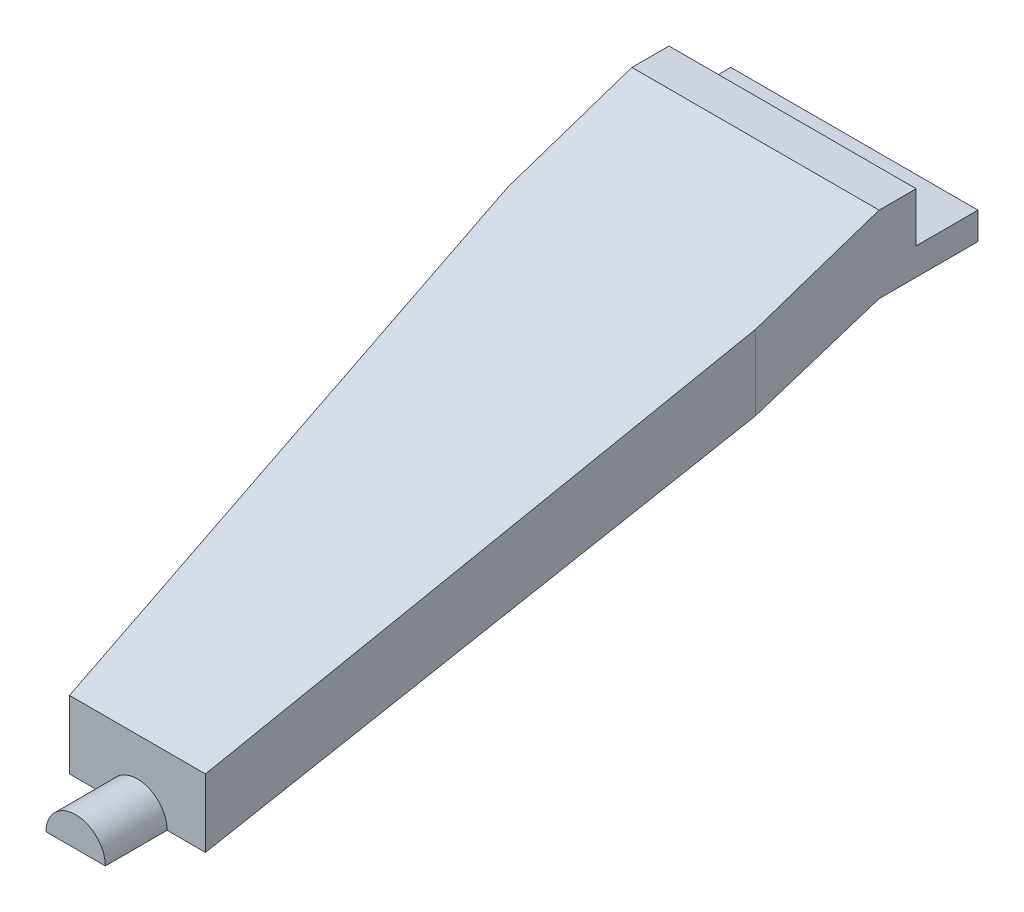
ISO-10303-21;
HEADER;
FILE_DESCRIPTION(('STEP AP214'),'2;1');
FILE_NAME('part.step','',(''),(''),'','','');
FILE_SCHEMA(('AUTOMOTIVE_DESIGN { 1 0 10303 214 1 1 1 1 }'));
ENDSEC;
DATA;
#1=APPLICATION_CONTEXT('core data for automotive mechanical design processes');
#2=APPLICATION_PROTOCOL_DEFINITION('international standard','automotive_design',2000,#1);
#3=PRODUCT_CONTEXT('',#1,'mechanical');
#4=PRODUCT('Part','Part','',(#3));
#5=PRODUCT_RELATED_PRODUCT_CATEGORY('part','',(#4));
#6=PRODUCT_DEFINITION_FORMATION('','',#4);
#7=PRODUCT_DEFINITION_CONTEXT('part definition',#1,'design');
#8=PRODUCT_DEFINITION('design','',#6,#7);
#9=PRODUCT_DEFINITION_SHAPE('','',#8);
#10=(LENGTH_UNIT() NAMED_UNIT(*) SI_UNIT(.MILLI.,.METRE.));
#11=(NAMED_UNIT(*) PLANE_ANGLE_UNIT() SI_UNIT($,.RADIAN.));
#12=(NAMED_UNIT(*) SI_UNIT($,.STERADIAN.) SOLID_ANGLE_UNIT());
#13=UNCERTAINTY_MEASURE_WITH_UNIT(LENGTH_MEASURE(1.E-05),#10,'distance_accuracy_value','');
#14=(GEOMETRIC_REPRESENTATION_CONTEXT(3) GLOBAL_UNCERTAINTY_ASSIGNED_CONTEXT((#13)) GLOBAL_UNIT_ASSIGNED_CONTEXT((#10,
#11,#12)) REPRESENTATION_CONTEXT('',''));
#15=CARTESIAN_POINT('',(0.,0.,0.));
#16=DIRECTION('',(0.,0.,1.));
#17=DIRECTION('',(1.,0.,0.));
#18=AXIS2_PLACEMENT_3D('',#15,#16,#17);
#19=CARTESIAN_POINT('',(0.,-16.0499999999997,0.));
#20=DIRECTION('',(0.,1.,0.));
#21=DIRECTION('',(0.,0.,1.));
#22=AXIS2_PLACEMENT_3D('',#19,#20,#21);
#23=PLANE('',#22);
#24=DIRECTION('',(0.,0.,1.));
#25=VECTOR('',#24,1.);
#26=CARTESIAN_POINT('',(7.59999999999997,-16.0499999999996,57.9999999999995));
#27=LINE('',#26,#25);
#28=CARTESIAN_POINT('',(7.59999999999997,-16.0499999999996,57.9999999999995));
#29=VERTEX_POINT('',#28);
#30=CARTESIAN_POINT('',(7.59999999999997,-16.0499999999996,62.9999999999995));
#31=VERTEX_POINT('',#30);
#32=EDGE_CURVE('E289',#29,#31,#27,.T.);
#33=ORIENTED_EDGE('',*,*,#32,.F.);
#34=DIRECTION('',(1.,0.,0.));
#35=VECTOR('',#34,1.);
#36=CARTESIAN_POINT('',(1.28369537222284E-13,-16.0499999999997,57.9999999999993));
#37=LINE('',#36,#35);
#38=CARTESIAN_POINT('',(12.4,-16.0499999999996,57.9999999999995));
#39=VERTEX_POINT('',#38);
#40=EDGE_CURVE('E169',#29,#39,#37,.T.);
#41=ORIENTED_EDGE('',*,*,#40,.T.);
#42=DIRECTION('',(0.,0.,1.));
#43=VECTOR('',#42,1.);
#44=CARTESIAN_POINT('',(12.4,-16.0499999999996,57.9999999999995));
#45=LINE('',#44,#43);
#46=CARTESIAN_POINT('',(12.4,-16.0499999999996,62.9999999999995));
#47=VERTEX_POINT('',#46);
#48=EDGE_CURVE('E293',#39,#47,#45,.T.);
#49=ORIENTED_EDGE('',*,*,#48,.T.);
#50=DIRECTION('',(1.,0.,0.));
#51=VECTOR('',#50,1.);
#52=CARTESIAN_POINT('',(0.,-16.0499999999996,62.9999999999993));
#53=LINE('',#52,#51);
#54=EDGE_CURVE('E177',#31,#47,#53,.T.);
#55=ORIENTED_EDGE('',*,*,#54,.F.);
#56=EDGE_LOOP('',(#33,#41,#49,#55));
#57=FACE_BOUND('',#56,.T.);
#58=ADVANCED_FACE('F65',(#57),#23,.F.);
#59=CARTESIAN_POINT('',(1.28369537222284E-13,0.,62.9999999999995));
#60=DIRECTION('',(0.,0.,1.));
#61=DIRECTION('',(0.,-1.,0.));
#62=AXIS2_PLACEMENT_3D('',#59,#60,#61);
#63=PLANE('',#62);
#64=ORIENTED_EDGE('',*,*,#54,.T.);
#65=CARTESIAN_POINT('',(9.99999999999998,-16.0499999999998,62.9999999999995));
#66=DIRECTION('',(0.,0.,1.));
#67=DIRECTION('',(1.,0.,0.));
#68=AXIS2_PLACEMENT_3D('',#65,#66,#67);
#69=CIRCLE('',#68,2.4);
#70=EDGE_CURVE('E299',#47,#31,#69,.T.);
#71=ORIENTED_EDGE('',*,*,#70,.T.);
#72=EDGE_LOOP('',(#64,#71));
#73=FACE_BOUND('',#72,.T.);
#74=ADVANCED_FACE('F235',(#73),#63,.T.);
#75=CARTESIAN_POINT('',(20.,2.2,0.));
#76=DIRECTION('',(1.,0.,0.));
#77=DIRECTION('',(0.,0.,-1.));
#78=AXIS2_PLACEMENT_3D('',#75,#76,#77);
#79=PLANE('',#78);
#80=DIRECTION('',(0.,-0.31764972280847,0.948208127786139));
#81=VECTOR('',#80,1.);
#82=CARTESIAN_POINT('',(20.,7.98399604397154,2.67463867473144));
#83=LINE('',#82,#81);
#84=CARTESIAN_POINT('',(19.9999999999973,6.20000000000593,8.));
#85=VERTEX_POINT('',#84);
#86=CARTESIAN_POINT('',(20.,2.85000000000474,18.));
#87=VERTEX_POINT('',#86);
#88=EDGE_CURVE('E267',#85,#87,#83,.T.);
#89=ORIENTED_EDGE('',*,*,#88,.T.);
#90=DIRECTION('',(0.,1.,0.));
#91=VECTOR('',#90,1.);
#92=CARTESIAN_POINT('',(20.,-16.0499999999998,18.));
#93=LINE('',#92,#91);
#94=CARTESIAN_POINT('',(20.,-3.20999999999994,18.));
#95=VERTEX_POINT('',#94);
#96=EDGE_CURVE('E283',#95,#87,#93,.T.);
#97=ORIENTED_EDGE('',*,*,#96,.F.);
#98=DIRECTION('',(0.,0.305639305857185,-0.952147370271603));
#99=VECTOR('',#98,1.);
#100=CARTESIAN_POINT('',(20.,2.32810929058853,0.747323082278942));
#101=LINE('',#100,#99);
#102=CARTESIAN_POINT('',(20.,0.,8.));
#103=VERTEX_POINT('',#102);
#104=EDGE_CURVE('E180',#95,#103,#101,.T.);
#105=ORIENTED_EDGE('',*,*,#104,.T.);
#106=DIRECTION('',(0.,0.,1.));
#107=VECTOR('',#106,1.);
#108=CARTESIAN_POINT('',(20.,0.,0.));
#109=LINE('',#108,#107);
#110=CARTESIAN_POINT('',(20.,0.,0.));
#111=VERTEX_POINT('',#110);
#112=EDGE_CURVE('E116',#111,#103,#109,.T.);
#113=ORIENTED_EDGE('',*,*,#112,.F.);
#114=DIRECTION('',(0.,-1.,0.));
#115=VECTOR('',#114,1.);
#116=CARTESIAN_POINT('',(20.,2.2,0.));
#117=LINE('',#116,#115);
#118=CARTESIAN_POINT('',(20.,2.2,0.));
#119=VERTEX_POINT('',#118);
#120=EDGE_CURVE('E92',#119,#111,#117,.T.);
#121=ORIENTED_EDGE('',*,*,#120,.F.);
#122=DIRECTION('',(0.,0.,1.));
#123=VECTOR('',#122,1.);
#124=CARTESIAN_POINT('',(20.,2.2,0.));
#125=LINE('',#124,#123);
#126=CARTESIAN_POINT('',(20.,2.2,5.));
#127=VERTEX_POINT('',#126);
#128=EDGE_CURVE('E113',#119,#127,#125,.T.);
#129=ORIENTED_EDGE('',*,*,#128,.T.);
#130=DIRECTION('',(0.,1.,0.));
#131=VECTOR('',#130,1.);
#132=CARTESIAN_POINT('',(19.9999999999973,0.,5.));
#133=LINE('',#132,#131);
#134=CARTESIAN_POINT('',(19.9999999999973,6.20000000000593,5.));
#135=VERTEX_POINT('',#134);
#136=EDGE_CURVE('E192',#127,#135,#133,.T.);
#137=ORIENTED_EDGE('',*,*,#136,.T.);
#138=DIRECTION('',(0.,0.,-1.));
#139=VECTOR('',#138,1.);
#140=CARTESIAN_POINT('',(19.9999999999973,6.20000000000593,8.));
#141=LINE('',#140,#139);
#142=EDGE_CURVE('E199',#85,#135,#141,.T.);
#143=ORIENTED_EDGE('',*,*,#142,.F.);
#144=EDGE_LOOP('',(#89,#97,#105,#113,#121,#129,#137,#143));
#145=FACE_BOUND('',#144,.T.);
#146=ADVANCED_FACE('F111',(#145),#79,.T.);
#147=CARTESIAN_POINT('',(0.,7.98399604397154,2.67463867473141));
#148=DIRECTION('',(0.,0.948208127786142,0.317649722808471));
#149=DIRECTION('',(0.,-0.317649722808471,0.948208127786143));
#150=AXIS2_PLACEMENT_3D('',#147,#148,#149);
#151=PLANE('',#150);
#152=DIRECTION('',(1.,0.,0.));
#153=VECTOR('',#152,1.);
#154=CARTESIAN_POINT('',(0.,-10.5499999999999,57.9999999999999));
#155=LINE('',#154,#153);
#156=CARTESIAN_POINT('',(4.49999999999995,-10.549999999999,57.9999999999995));
#157=VERTEX_POINT('',#156);
#158=CARTESIAN_POINT('',(15.5,-10.549999999999,57.9999999999995));
#159=VERTEX_POINT('',#158);
#160=EDGE_CURVE('E184',#157,#159,#155,.T.);
#161=ORIENTED_EDGE('',*,*,#160,.T.);
#162=DIRECTION('',(0.106071615549872,0.315857699637507,-0.942858804887743));
#163=VECTOR('',#162,1.);
#164=CARTESIAN_POINT('',(21.4796811885696,7.2561617615247,4.84727832382572));
#165=LINE('',#164,#163);
#166=EDGE_CURVE('E279',#159,#87,#165,.T.);
#167=ORIENTED_EDGE('',*,*,#166,.T.);
#168=ORIENTED_EDGE('',*,*,#88,.F.);
#169=DIRECTION('',(1.,0.,0.));
#170=VECTOR('',#169,1.);
#171=CARTESIAN_POINT('',(0.,6.20000000000593,8.));
#172=LINE('',#171,#170);
#173=CARTESIAN_POINT('',(0.,6.20000000000605,7.99999999999983));
#174=VERTEX_POINT('',#173);
#175=EDGE_CURVE('E188',#174,#85,#172,.T.);
#176=ORIENTED_EDGE('',*,*,#175,.F.);
#177=DIRECTION('',(0.,-0.31764972280847,0.948208127786139));
#178=VECTOR('',#177,1.);
#179=CARTESIAN_POINT('',(0.,7.98399604397154,2.67463867473141));
#180=LINE('',#179,#178);
#181=CARTESIAN_POINT('',(0.,2.85000000000473,18.));
#182=VERTEX_POINT('',#181);
#183=EDGE_CURVE('E272',#174,#182,#180,.T.);
#184=ORIENTED_EDGE('',*,*,#183,.T.);
#185=DIRECTION('',(-0.10607161554987,0.315857699637506,-0.942858804887743));
#186=VECTOR('',#185,1.);
#187=CARTESIAN_POINT('',(-1.7047049410768,7.92623249121302,2.84706719042844));
#188=LINE('',#187,#186);
#189=EDGE_CURVE('E281',#157,#182,#188,.T.);
#190=ORIENTED_EDGE('',*,*,#189,.F.);
#191=EDGE_LOOP('',(#161,#167,#168,#176,#184,#190));
#192=FACE_BOUND('',#191,.T.);
#193=ADVANCED_FACE('F246',(#192),#151,.T.);
#194=CARTESIAN_POINT('',(0.,2.32810929058853,0.747323082278914));
#195=DIRECTION('',(0.,-0.952147370271607,-0.305639305857187));
#196=DIRECTION('',(0.,0.305639305857187,-0.952147370271607));
#197=AXIS2_PLACEMENT_3D('',#194,#195,#196);
#198=PLANE('',#197);
#199=ORIENTED_EDGE('',*,*,#104,.F.);
#200=DIRECTION('',(-0.106507291622807,-0.303900805430409,0.946731481091615));
#201=VECTOR('',#200,1.);
#202=CARTESIAN_POINT('',(21.6920326056195,1.61793303470101,2.95971017227122));
#203=LINE('',#202,#201);
#204=CARTESIAN_POINT('',(15.4999999999999,-16.0499999999998,57.9999999999999));
#205=VERTEX_POINT('',#204);
#206=EDGE_CURVE('E12',#95,#205,#203,.T.);
#207=ORIENTED_EDGE('',*,*,#206,.T.);
#208=DIRECTION('',(1.,0.,0.));
#209=VECTOR('',#208,1.);
#210=CARTESIAN_POINT('',(0.,-16.0499999999996,57.9999999999995));
#211=LINE('',#210,#209);
#212=EDGE_CURVE('E296',#39,#205,#211,.T.);
#213=ORIENTED_EDGE('',*,*,#212,.F.);
#214=ORIENTED_EDGE('',*,*,#40,.F.);
#215=CARTESIAN_POINT('',(4.49999999999995,-16.0499999999998,57.9999999999995));
#216=VERTEX_POINT('',#215);
#217=EDGE_CURVE('E164',#216,#29,#37,.T.);
#218=ORIENTED_EDGE('',*,*,#217,.F.);
#219=DIRECTION('',(0.106507291622806,-0.303900805430409,0.946731481091615));
#220=VECTOR('',#219,1.);
#221=CARTESIAN_POINT('',(-1.918908668996,2.26528606886865,0.94303405336888));
#222=LINE('',#221,#220);
#223=CARTESIAN_POINT('',(0.,-3.20999999999995,18.));
#224=VERTEX_POINT('',#223);
#225=EDGE_CURVE('E74',#224,#216,#222,.T.);
#226=ORIENTED_EDGE('',*,*,#225,.F.);
#227=DIRECTION('',(0.,0.305639305857185,-0.952147370271603));
#228=VECTOR('',#227,1.);
#229=CARTESIAN_POINT('',(0.,2.32810929058853,0.747323082278914));
#230=LINE('',#229,#228);
#231=CARTESIAN_POINT('',(0.,0.,7.99999999999997));
#232=VERTEX_POINT('',#231);
#233=EDGE_CURVE('E187',#224,#232,#230,.T.);
#234=ORIENTED_EDGE('',*,*,#233,.T.);
#235=DIRECTION('',(1.,0.,0.));
#236=VECTOR('',#235,1.);
#237=CARTESIAN_POINT('',(0.,0.,8.));
#238=LINE('',#237,#236);
#239=EDGE_CURVE('E191',#232,#103,#238,.T.);
#240=ORIENTED_EDGE('',*,*,#239,.T.);
#241=EDGE_LOOP('',(#199,#207,#213,#214,#218,#226,#234,#240));
#242=FACE_BOUND('',#241,.T.);
#243=ADVANCED_FACE('F166',(#242),#198,.T.);
#244=CARTESIAN_POINT('',(0.,2.2,0.));
#245=DIRECTION('',(0.,-1.,0.));
#246=DIRECTION('',(0.,0.,-1.));
#247=AXIS2_PLACEMENT_3D('',#244,#245,#246);
#248=PLANE('',#247);
#249=DIRECTION('',(1.,0.,0.));
#250=VECTOR('',#249,1.);
#251=CARTESIAN_POINT('',(0.,2.2,0.));
#252=LINE('',#251,#250);
#253=CARTESIAN_POINT('',(0.,2.2,0.));
#254=VERTEX_POINT('',#253);
#255=EDGE_CURVE('E125',#254,#119,#252,.T.);
#256=ORIENTED_EDGE('',*,*,#255,.F.);
#257=DIRECTION('',(0.,0.,1.));
#258=VECTOR('',#257,1.);
#259=CARTESIAN_POINT('',(0.,2.2,0.));
#260=LINE('',#259,#258);
#261=CARTESIAN_POINT('',(0.,2.2,5.));
#262=VERTEX_POINT('',#261);
#263=EDGE_CURVE('E118',#254,#262,#260,.T.);
#264=ORIENTED_EDGE('',*,*,#263,.T.);
#265=DIRECTION('',(1.,0.,0.));
#266=VECTOR('',#265,1.);
#267=CARTESIAN_POINT('',(0.,2.2,5.));
#268=LINE('',#267,#266);
#269=EDGE_CURVE('E100',#262,#127,#268,.T.);
#270=ORIENTED_EDGE('',*,*,#269,.T.);
#271=ORIENTED_EDGE('',*,*,#128,.F.);
#272=EDGE_LOOP('',(#256,#264,#270,#271));
#273=FACE_BOUND('',#272,.T.);
#274=CARTESIAN_POINT('',(4.,2.2,2.5));
#275=DIRECTION('',(0.,1.,0.));
#276=DIRECTION('',(0.,0.,1.));
#277=AXIS2_PLACEMENT_3D('',#274,#275,#276);
#278=CIRCLE('',#277,0.800000000000001);
#279=CARTESIAN_POINT('',(4.,2.2,3.3));
#280=VERTEX_POINT('',#279);
#281=EDGE_CURVE('E139',#280,#280,#278,.T.);
#282=ORIENTED_EDGE('',*,*,#281,.F.);
#283=EDGE_LOOP('',(#282));
#284=FACE_BOUND('',#283,.T.);
#285=CARTESIAN_POINT('',(16.,2.2,2.5));
#286=DIRECTION('',(0.,1.,0.));
#287=DIRECTION('',(0.,0.,1.));
#288=AXIS2_PLACEMENT_3D('',#285,#286,#287);
#289=CIRCLE('',#288,0.799999999999999);
#290=CARTESIAN_POINT('',(16.,2.2,3.3));
#291=VERTEX_POINT('',#290);
#292=EDGE_CURVE('E205',#291,#291,#289,.T.);
#293=ORIENTED_EDGE('',*,*,#292,.F.);
#294=EDGE_LOOP('',(#293));
#295=FACE_BOUND('',#294,.T.);
#296=ADVANCED_FACE('F122',(#273,#284,#295),#248,.F.);
#297=CARTESIAN_POINT('',(0.,0.,0.));
#298=DIRECTION('',(0.,-1.,0.));
#299=DIRECTION('',(0.,0.,-1.));
#300=AXIS2_PLACEMENT_3D('',#297,#298,#299);
#301=PLANE('',#300);
#302=CARTESIAN_POINT('',(4.,0.,2.5));
#303=DIRECTION('',(0.,1.,0.));
#304=DIRECTION('',(0.,0.,1.));
#305=AXIS2_PLACEMENT_3D('',#302,#303,#304);
#306=CIRCLE('',#305,0.800000000000001);
#307=CARTESIAN_POINT('',(4.,0.,3.3));
#308=VERTEX_POINT('',#307);
#309=EDGE_CURVE('E132',#308,#308,#306,.T.);
#310=ORIENTED_EDGE('',*,*,#309,.T.);
#311=EDGE_LOOP('',(#310));
#312=FACE_BOUND('',#311,.T.);
#313=DIRECTION('',(1.,0.,0.));
#314=VECTOR('',#313,1.);
#315=CARTESIAN_POINT('',(0.,0.,0.));
#316=LINE('',#315,#314);
#317=CARTESIAN_POINT('',(0.,0.,0.));
#318=VERTEX_POINT('',#317);
#319=EDGE_CURVE('E137',#318,#111,#316,.T.);
#320=ORIENTED_EDGE('',*,*,#319,.T.);
#321=ORIENTED_EDGE('',*,*,#112,.T.);
#322=ORIENTED_EDGE('',*,*,#239,.F.);
#323=DIRECTION('',(0.,0.,1.));
#324=VECTOR('',#323,1.);
#325=CARTESIAN_POINT('',(0.,0.,0.));
#326=LINE('',#325,#324);
#327=EDGE_CURVE('E127',#318,#232,#326,.T.);
#328=ORIENTED_EDGE('',*,*,#327,.F.);
#329=EDGE_LOOP('',(#320,#321,#322,#328));
#330=FACE_BOUND('',#329,.T.);
#331=CARTESIAN_POINT('',(16.,0.,2.5));
#332=DIRECTION('',(0.,1.,0.));
#333=DIRECTION('',(0.,0.,1.));
#334=AXIS2_PLACEMENT_3D('',#331,#332,#333);
#335=CIRCLE('',#334,0.799999999999999);
#336=CARTESIAN_POINT('',(16.,0.,3.3));
#337=VERTEX_POINT('',#336);
#338=EDGE_CURVE('E202',#337,#337,#335,.T.);
#339=ORIENTED_EDGE('',*,*,#338,.T.);
#340=EDGE_LOOP('',(#339));
#341=FACE_BOUND('',#340,.T.);
#342=ADVANCED_FACE('F215',(#312,#330,#341),#301,.T.);
#343=CARTESIAN_POINT('',(0.,2.2,0.));
#344=DIRECTION('',(0.,0.,-1.));
#345=DIRECTION('',(-1.,0.,0.));
#346=AXIS2_PLACEMENT_3D('',#343,#344,#345);
#347=PLANE('',#346);
#348=ORIENTED_EDGE('',*,*,#319,.F.);
#349=DIRECTION('',(0.,-1.,0.));
#350=VECTOR('',#349,1.);
#351=CARTESIAN_POINT('',(0.,2.2,0.));
#352=LINE('',#351,#350);
#353=EDGE_CURVE('E82',#254,#318,#352,.T.);
#354=ORIENTED_EDGE('',*,*,#353,.F.);
#355=ORIENTED_EDGE('',*,*,#255,.T.);
#356=ORIENTED_EDGE('',*,*,#120,.T.);
#357=EDGE_LOOP('',(#348,#354,#355,#356));
#358=FACE_BOUND('',#357,.T.);
#359=ADVANCED_FACE('F67',(#358),#347,.T.);
#360=CARTESIAN_POINT('',(0.,2.2,0.));
#361=DIRECTION('',(1.,0.,0.));
#362=DIRECTION('',(0.,0.,-1.));
#363=AXIS2_PLACEMENT_3D('',#360,#361,#362);
#364=PLANE('',#363);
#365=ORIENTED_EDGE('',*,*,#233,.F.);
#366=DIRECTION('',(0.,1.,0.));
#367=VECTOR('',#366,1.);
#368=CARTESIAN_POINT('',(0.,-16.0499999999998,18.));
#369=LINE('',#368,#367);
#370=EDGE_CURVE('E156',#224,#182,#369,.T.);
#371=ORIENTED_EDGE('',*,*,#370,.T.);
#372=ORIENTED_EDGE('',*,*,#183,.F.);
#373=DIRECTION('',(0.,0.,-1.));
#374=VECTOR('',#373,1.);
#375=CARTESIAN_POINT('',(0.,6.20000000000593,8.));
#376=LINE('',#375,#374);
#377=CARTESIAN_POINT('',(0.,6.20000000000593,5.));
#378=VERTEX_POINT('',#377);
#379=EDGE_CURVE('E194',#174,#378,#376,.T.);
#380=ORIENTED_EDGE('',*,*,#379,.T.);
#381=DIRECTION('',(0.,1.,0.));
#382=VECTOR('',#381,1.);
#383=CARTESIAN_POINT('',(0.,0.,5.));
#384=LINE('',#383,#382);
#385=EDGE_CURVE('E173',#262,#378,#384,.T.);
#386=ORIENTED_EDGE('',*,*,#385,.F.);
#387=ORIENTED_EDGE('',*,*,#263,.F.);
#388=ORIENTED_EDGE('',*,*,#353,.T.);
#389=ORIENTED_EDGE('',*,*,#327,.T.);
#390=EDGE_LOOP('',(#365,#371,#372,#380,#386,#387,#388,#389));
#391=FACE_BOUND('',#390,.T.);
#392=ADVANCED_FACE('F221',(#391),#364,.F.);
#393=CARTESIAN_POINT('',(4.,2.2,2.5));
#394=DIRECTION('',(0.,-1.,0.));
#395=DIRECTION('',(0.,0.,-1.));
#396=AXIS2_PLACEMENT_3D('',#393,#394,#395);
#397=CYLINDRICAL_SURFACE('',#396,0.800000000000001);
#398=ORIENTED_EDGE('',*,*,#281,.T.);
#399=EDGE_LOOP('',(#398));
#400=FACE_BOUND('',#399,.T.);
#401=ORIENTED_EDGE('',*,*,#309,.F.);
#402=EDGE_LOOP('',(#401));
#403=FACE_BOUND('',#402,.T.);
#404=ADVANCED_FACE('F218',(#400,#403),#397,.F.);
#405=CARTESIAN_POINT('',(16.,2.2,2.5));
#406=DIRECTION('',(0.,-1.,0.));
#407=DIRECTION('',(0.,0.,-1.));
#408=AXIS2_PLACEMENT_3D('',#405,#406,#407);
#409=CYLINDRICAL_SURFACE('',#408,0.799999999999999);
#410=ORIENTED_EDGE('',*,*,#292,.T.);
#411=EDGE_LOOP('',(#410));
#412=FACE_BOUND('',#411,.T.);
#413=ORIENTED_EDGE('',*,*,#338,.F.);
#414=EDGE_LOOP('',(#413));
#415=FACE_BOUND('',#414,.T.);
#416=ADVANCED_FACE('F220',(#412,#415),#409,.F.);
#417=CARTESIAN_POINT('',(0.,0.,5.));
#418=DIRECTION('',(0.,0.,-1.));
#419=DIRECTION('',(-1.,0.,0.));
#420=AXIS2_PLACEMENT_3D('',#417,#418,#419);
#421=PLANE('',#420);
#422=ORIENTED_EDGE('',*,*,#269,.F.);
#423=ORIENTED_EDGE('',*,*,#385,.T.);
#424=DIRECTION('',(1.,0.,0.));
#425=VECTOR('',#424,1.);
#426=CARTESIAN_POINT('',(0.,6.20000000000593,5.));
#427=LINE('',#426,#425);
#428=EDGE_CURVE('E175',#378,#135,#427,.T.);
#429=ORIENTED_EDGE('',*,*,#428,.T.);
#430=ORIENTED_EDGE('',*,*,#136,.F.);
#431=EDGE_LOOP('',(#422,#423,#429,#430));
#432=FACE_BOUND('',#431,.T.);
#433=ADVANCED_FACE('F227',(#432),#421,.T.);
#434=CARTESIAN_POINT('',(0.,6.20000000000593,8.));
#435=DIRECTION('',(0.,1.,0.));
#436=DIRECTION('',(0.,0.,1.));
#437=AXIS2_PLACEMENT_3D('',#434,#435,#436);
#438=PLANE('',#437);
#439=ORIENTED_EDGE('',*,*,#428,.F.);
#440=ORIENTED_EDGE('',*,*,#379,.F.);
#441=ORIENTED_EDGE('',*,*,#175,.T.);
#442=ORIENTED_EDGE('',*,*,#142,.T.);
#443=EDGE_LOOP('',(#439,#440,#441,#442));
#444=FACE_BOUND('',#443,.T.);
#445=ADVANCED_FACE('F252',(#444),#438,.T.);
#446=CARTESIAN_POINT('',(-1.99969140564728,-16.0499999999998,0.224965283135317));
#447=DIRECTION('',(0.993731316158802,0.,-0.111794773067865));
#448=DIRECTION('',(-0.111794773067865,0.,-0.993731316158802));
#449=AXIS2_PLACEMENT_3D('',#446,#447,#448);
#450=PLANE('',#449);
#451=ORIENTED_EDGE('',*,*,#189,.T.);
#452=ORIENTED_EDGE('',*,*,#370,.F.);
#453=ORIENTED_EDGE('',*,*,#225,.T.);
#454=DIRECTION('',(0.,1.,0.));
#455=VECTOR('',#454,1.);
#456=CARTESIAN_POINT('',(4.49999999999995,-16.0499999999998,57.9999999999999));
#457=LINE('',#456,#455);
#458=EDGE_CURVE('E152',#216,#157,#457,.T.);
#459=ORIENTED_EDGE('',*,*,#458,.T.);
#460=EDGE_LOOP('',(#451,#452,#453,#459));
#461=FACE_BOUND('',#460,.T.);
#462=ADVANCED_FACE('F149',(#461),#450,.F.);
#463=CARTESIAN_POINT('',(21.7497299799413,-16.0499999999998,2.44684462274341));
#464=DIRECTION('',(0.993731316158802,0.,0.111794773067866));
#465=DIRECTION('',(0.111794773067866,0.,-0.993731316158802));
#466=AXIS2_PLACEMENT_3D('',#463,#464,#465);
#467=PLANE('',#466);
#468=DIRECTION('',(0.,1.,0.));
#469=VECTOR('',#468,1.);
#470=CARTESIAN_POINT('',(15.4999999999999,-16.0499999999998,57.9999999999999));
#471=LINE('',#470,#469);
#472=EDGE_CURVE('E285',#205,#159,#471,.T.);
#473=ORIENTED_EDGE('',*,*,#472,.F.);
#474=ORIENTED_EDGE('',*,*,#206,.F.);
#475=ORIENTED_EDGE('',*,*,#96,.T.);
#476=ORIENTED_EDGE('',*,*,#166,.F.);
#477=EDGE_LOOP('',(#473,#474,#475,#476));
#478=FACE_BOUND('',#477,.T.);
#479=ADVANCED_FACE('F259',(#478),#467,.T.);
#480=CARTESIAN_POINT('',(9.99999999999998,-16.0499999999998,57.9999999999995));
#481=DIRECTION('',(0.,0.,1.));
#482=DIRECTION('',(1.,0.,0.));
#483=AXIS2_PLACEMENT_3D('',#480,#481,#482);
#484=CYLINDRICAL_SURFACE('',#483,2.4);
#485=ORIENTED_EDGE('',*,*,#70,.F.);
#486=ORIENTED_EDGE('',*,*,#48,.F.);
#487=CARTESIAN_POINT('',(9.99999999999998,-16.0499999999998,57.9999999999995));
#488=DIRECTION('',(0.,0.,1.));
#489=DIRECTION('',(1.,0.,0.));
#490=AXIS2_PLACEMENT_3D('',#487,#488,#489);
#491=CIRCLE('',#490,2.4);
#492=EDGE_CURVE('E302',#39,#29,#491,.T.);
#493=ORIENTED_EDGE('',*,*,#492,.T.);
#494=ORIENTED_EDGE('',*,*,#32,.T.);
#495=EDGE_LOOP('',(#485,#486,#493,#494));
#496=FACE_BOUND('',#495,.T.);
#497=ADVANCED_FACE('F309',(#496),#484,.T.);
#498=CARTESIAN_POINT('',(0.,0.,57.9999999999995));
#499=DIRECTION('',(0.,0.,1.));
#500=DIRECTION('',(1.,0.,0.));
#501=AXIS2_PLACEMENT_3D('',#498,#499,#500);
#502=PLANE('',#501);
#503=ORIENTED_EDGE('',*,*,#492,.F.);
#504=ORIENTED_EDGE('',*,*,#212,.T.);
#505=ORIENTED_EDGE('',*,*,#472,.T.);
#506=ORIENTED_EDGE('',*,*,#160,.F.);
#507=ORIENTED_EDGE('',*,*,#458,.F.);
#508=ORIENTED_EDGE('',*,*,#217,.T.);
#509=EDGE_LOOP('',(#503,#504,#505,#506,#507,#508));
#510=FACE_BOUND('',#509,.T.);
#511=ADVANCED_FACE('F314',(#510),#502,.T.);
#512=CLOSED_SHELL('',(#58,#74,#146,#193,#243,#296,#342,#359,#392,#404,#416,#433,#445,#462,#479,
#497,#511));
#513=MANIFOLD_SOLID_BREP('B2',#512);
#514=ADVANCED_BREP_SHAPE_REPRESENTATION('',(#18,#513),#14);
#515=SHAPE_DEFINITION_REPRESENTATION(#9,#514);
ENDSEC;
END-ISO-10303-21;
